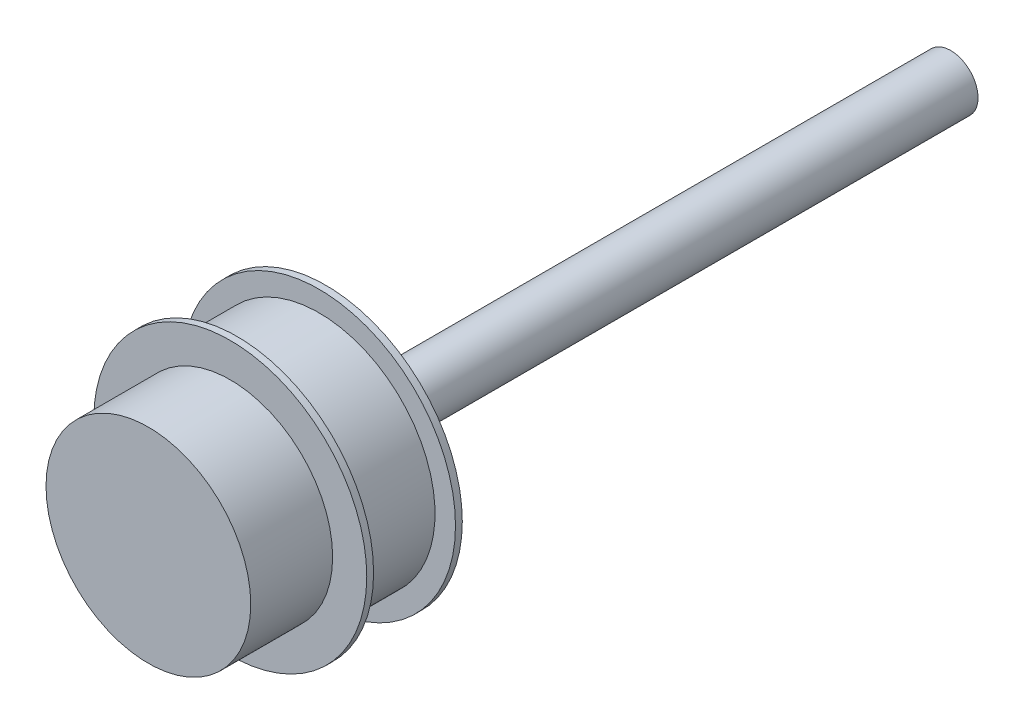
ISO-10303-21;
HEADER;
FILE_DESCRIPTION(('STEP AP214'),'2;1');
FILE_NAME('part.step','',(''),(''),'','','');
FILE_SCHEMA(('AUTOMOTIVE_DESIGN { 1 0 10303 214 1 1 1 1 }'));
ENDSEC;
DATA;
#1=APPLICATION_CONTEXT('core data for automotive mechanical design processes');
#2=APPLICATION_PROTOCOL_DEFINITION('international standard','automotive_design',2000,#1);
#3=PRODUCT_CONTEXT('',#1,'mechanical');
#4=PRODUCT('Part','Part','',(#3));
#5=PRODUCT_RELATED_PRODUCT_CATEGORY('part','',(#4));
#6=PRODUCT_DEFINITION_FORMATION('','',#4);
#7=PRODUCT_DEFINITION_CONTEXT('part definition',#1,'design');
#8=PRODUCT_DEFINITION('design','',#6,#7);
#9=PRODUCT_DEFINITION_SHAPE('','',#8);
#10=(LENGTH_UNIT() NAMED_UNIT(*) SI_UNIT(.MILLI.,.METRE.));
#11=(NAMED_UNIT(*) PLANE_ANGLE_UNIT() SI_UNIT($,.RADIAN.));
#12=(NAMED_UNIT(*) SI_UNIT($,.STERADIAN.) SOLID_ANGLE_UNIT());
#13=UNCERTAINTY_MEASURE_WITH_UNIT(LENGTH_MEASURE(1.E-05),#10,'distance_accuracy_value','');
#14=(GEOMETRIC_REPRESENTATION_CONTEXT(3) GLOBAL_UNCERTAINTY_ASSIGNED_CONTEXT((#13)) GLOBAL_UNIT_ASSIGNED_CONTEXT((#10,
#11,#12)) REPRESENTATION_CONTEXT('',''));
#15=CARTESIAN_POINT('',(0.,0.,0.));
#16=DIRECTION('',(0.,0.,1.));
#17=DIRECTION('',(1.,0.,0.));
#18=AXIS2_PLACEMENT_3D('',#15,#16,#17);
#19=CARTESIAN_POINT('',(0.,0.,104.56));
#20=DIRECTION('',(0.,0.,-1.));
#21=DIRECTION('',(-1.,0.,0.));
#22=AXIS2_PLACEMENT_3D('',#19,#20,#21);
#23=CYLINDRICAL_SURFACE('',#22,17.);
#24=CARTESIAN_POINT('',(0.,0.,104.56));
#25=DIRECTION('',(0.,0.,-1.));
#26=DIRECTION('',(-1.,0.,0.));
#27=AXIS2_PLACEMENT_3D('',#24,#25,#26);
#28=CIRCLE('',#27,17.);
#29=CARTESIAN_POINT('',(-17.,0.,104.56));
#30=VERTEX_POINT('',#29);
#31=EDGE_CURVE('E118',#30,#30,#28,.T.);
#32=CARTESIAN_POINT('',(0.,0.,92.56));
#33=DIRECTION('',(0.,0.,-1.));
#34=DIRECTION('',(-1.,0.,0.));
#35=AXIS2_PLACEMENT_3D('',#32,#33,#34);
#36=CIRCLE('',#35,17.);
#37=CARTESIAN_POINT('',(-17.,0.,92.56));
#38=VERTEX_POINT('',#37);
#39=EDGE_CURVE('E41',#38,#38,#36,.F.);
#40=CARTESIAN_POINT('',(-17.,0.,104.56));
#41=CARTESIAN_POINT('',(-17.,0.,104.435));
#42=CARTESIAN_POINT('',(-17.,0.,104.31));
#43=CARTESIAN_POINT('',(-17.,0.,104.06));
#44=CARTESIAN_POINT('',(-17.,0.,103.935));
#45=CARTESIAN_POINT('',(-17.,0.,103.685));
#46=CARTESIAN_POINT('',(-17.,0.,103.56));
#47=CARTESIAN_POINT('',(-17.,0.,103.31));
#48=CARTESIAN_POINT('',(-17.,0.,103.185));
#49=CARTESIAN_POINT('',(-17.,0.,102.935));
#50=CARTESIAN_POINT('',(-17.,0.,102.81));
#51=CARTESIAN_POINT('',(-17.,0.,102.56));
#52=CARTESIAN_POINT('',(-17.,0.,102.435));
#53=CARTESIAN_POINT('',(-17.,0.,102.185));
#54=CARTESIAN_POINT('',(-17.,0.,102.06));
#55=CARTESIAN_POINT('',(-17.,0.,101.81));
#56=CARTESIAN_POINT('',(-17.,0.,101.685));
#57=CARTESIAN_POINT('',(-17.,0.,101.435));
#58=CARTESIAN_POINT('',(-17.,0.,101.31));
#59=CARTESIAN_POINT('',(-17.,0.,101.06));
#60=CARTESIAN_POINT('',(-17.,0.,100.935));
#61=CARTESIAN_POINT('',(-17.,0.,100.685));
#62=CARTESIAN_POINT('',(-17.,0.,100.56));
#63=CARTESIAN_POINT('',(-17.,0.,100.31));
#64=CARTESIAN_POINT('',(-17.,0.,100.185));
#65=CARTESIAN_POINT('',(-17.,0.,99.935));
#66=CARTESIAN_POINT('',(-17.,0.,99.81));
#67=CARTESIAN_POINT('',(-17.,0.,99.56));
#68=CARTESIAN_POINT('',(-17.,0.,99.435));
#69=CARTESIAN_POINT('',(-17.,0.,99.185));
#70=CARTESIAN_POINT('',(-17.,0.,99.06));
#71=CARTESIAN_POINT('',(-17.,0.,98.81));
#72=CARTESIAN_POINT('',(-17.,0.,98.685));
#73=CARTESIAN_POINT('',(-17.,0.,98.435));
#74=CARTESIAN_POINT('',(-17.,0.,98.31));
#75=CARTESIAN_POINT('',(-17.,0.,98.06));
#76=CARTESIAN_POINT('',(-17.,0.,97.935));
#77=CARTESIAN_POINT('',(-17.,0.,97.685));
#78=CARTESIAN_POINT('',(-17.,0.,97.56));
#79=CARTESIAN_POINT('',(-17.,0.,97.31));
#80=CARTESIAN_POINT('',(-17.,0.,97.185));
#81=CARTESIAN_POINT('',(-17.,0.,96.935));
#82=CARTESIAN_POINT('',(-17.,0.,96.81));
#83=CARTESIAN_POINT('',(-17.,0.,96.56));
#84=CARTESIAN_POINT('',(-17.,0.,96.435));
#85=CARTESIAN_POINT('',(-17.,0.,96.185));
#86=CARTESIAN_POINT('',(-17.,0.,96.06));
#87=CARTESIAN_POINT('',(-17.,0.,95.81));
#88=CARTESIAN_POINT('',(-17.,0.,95.685));
#89=CARTESIAN_POINT('',(-17.,0.,95.435));
#90=CARTESIAN_POINT('',(-17.,0.,95.31));
#91=CARTESIAN_POINT('',(-17.,0.,95.06));
#92=CARTESIAN_POINT('',(-17.,0.,94.935));
#93=CARTESIAN_POINT('',(-17.,0.,94.685));
#94=CARTESIAN_POINT('',(-17.,0.,94.56));
#95=CARTESIAN_POINT('',(-17.,0.,94.31));
#96=CARTESIAN_POINT('',(-17.,0.,94.185));
#97=CARTESIAN_POINT('',(-17.,0.,93.935));
#98=CARTESIAN_POINT('',(-17.,0.,93.81));
#99=CARTESIAN_POINT('',(-17.,0.,93.56));
#100=CARTESIAN_POINT('',(-17.,0.,93.435));
#101=CARTESIAN_POINT('',(-17.,0.,93.185));
#102=CARTESIAN_POINT('',(-17.,0.,93.06));
#103=CARTESIAN_POINT('',(-17.,0.,92.81));
#104=CARTESIAN_POINT('',(-17.,0.,92.685));
#105=CARTESIAN_POINT('',(-17.,0.,92.56));
#106=B_SPLINE_CURVE_WITH_KNOTS('',3,(#40,#41,#42,#43,#44,#45,#46,#47,#48,#49,#50,#51,#52,#53,
#54,#55,#56,#57,#58,#59,#60,#61,#62,#63,#64,#65,#66,#67,#68,#69,#70,#71,#72,#73,#74,#75,#76,#77,
#78,#79,#80,#81,#82,#83,#84,#85,#86,#87,#88,#89,#90,#91,#92,#93,#94,#95,#96,#97,#98,#99,#100,
#101,#102,#103,#104,#105),.UNSPECIFIED.,.F.,.F.,(4,2,2,2,2,2,2,2,2,2,2,2,2,2,2,2,2,2,2,2,2,2,2,
2,2,2,2,2,2,2,2,2,4),(0.,0.374999999999986,0.749999999999987,1.12499999999999,1.49999999999999,
1.87499999999999,2.24999999999999,2.62499999999999,2.99999999999999,3.37499999999999,
3.74999999999999,4.12499999999999,4.49999999999999,4.87499999999999,5.24999999999999,
5.62499999999999,5.99999999999999,6.37499999999999,6.74999999999999,7.12499999999999,
7.49999999999999,7.87499999999999,8.24999999999999,8.62499999999999,8.99999999999999,
9.37499999999999,9.74999999999999,10.125,10.5,10.875,11.25,11.625,12.),.UNSPECIFIED.);
#107=EDGE_CURVE('BSEAM37',#30,#38,#106,.T.);
#108=ORIENTED_EDGE('',*,*,#31,.T.);
#109=ORIENTED_EDGE('',*,*,#39,.T.);
#110=ORIENTED_EDGE('',*,*,#107,.T.);
#111=ORIENTED_EDGE('',*,*,#107,.F.);
#112=EDGE_LOOP('',(#108,#110,#109,#111));
#113=FACE_BOUND('',#112,.T.);
#114=ADVANCED_FACE('F37',(#113),#23,.T.);
#115=CARTESIAN_POINT('',(0.,0.,105.56));
#116=DIRECTION('',(0.,0.,-1.));
#117=DIRECTION('',(-1.,0.,0.));
#118=AXIS2_PLACEMENT_3D('',#115,#116,#117);
#119=CYLINDRICAL_SURFACE('',#118,20.);
#120=CARTESIAN_POINT('',(0.,0.,105.56));
#121=DIRECTION('',(0.,0.,1.));
#122=DIRECTION('',(1.,0.,0.));
#123=AXIS2_PLACEMENT_3D('',#120,#121,#122);
#124=CIRCLE('',#123,20.);
#125=CARTESIAN_POINT('',(20.,0.,105.56));
#126=VERTEX_POINT('',#125);
#127=EDGE_CURVE('E56',#126,#126,#124,.T.);
#128=ORIENTED_EDGE('',*,*,#127,.F.);
#129=EDGE_LOOP('',(#128));
#130=FACE_BOUND('',#129,.T.);
#131=CARTESIAN_POINT('',(0.,0.,104.56));
#132=DIRECTION('',(0.,0.,-1.));
#133=DIRECTION('',(-1.,0.,0.));
#134=AXIS2_PLACEMENT_3D('',#131,#132,#133);
#135=CIRCLE('',#134,20.);
#136=CARTESIAN_POINT('',(-20.,0.,104.56));
#137=VERTEX_POINT('',#136);
#138=EDGE_CURVE('E119',#137,#137,#135,.T.);
#139=ORIENTED_EDGE('',*,*,#138,.F.);
#140=EDGE_LOOP('',(#139));
#141=FACE_BOUND('',#140,.T.);
#142=ADVANCED_FACE('F76',(#130,#141),#119,.T.);
#143=CARTESIAN_POINT('',(0.,0.,105.56));
#144=DIRECTION('',(0.,0.,1.));
#145=DIRECTION('',(1.,0.,0.));
#146=AXIS2_PLACEMENT_3D('',#143,#144,#145);
#147=PLANE('',#146);
#148=CARTESIAN_POINT('',(0.,0.,105.56));
#149=DIRECTION('',(0.,0.,1.));
#150=DIRECTION('',(1.,0.,0.));
#151=AXIS2_PLACEMENT_3D('',#148,#149,#150);
#152=CIRCLE('',#151,15.);
#153=CARTESIAN_POINT('',(15.,0.,105.56));
#154=VERTEX_POINT('',#153);
#155=EDGE_CURVE('E10',#154,#154,#152,.T.);
#156=ORIENTED_EDGE('',*,*,#155,.F.);
#157=EDGE_LOOP('',(#156));
#158=FACE_BOUND('',#157,.T.);
#159=ORIENTED_EDGE('',*,*,#127,.T.);
#160=EDGE_LOOP('',(#159));
#161=FACE_BOUND('',#160,.T.);
#162=ADVANCED_FACE('F82',(#158,#161),#147,.T.);
#163=CARTESIAN_POINT('',(0.,0.,117.56));
#164=DIRECTION('',(0.,0.,-1.));
#165=DIRECTION('',(-1.,0.,0.));
#166=AXIS2_PLACEMENT_3D('',#163,#164,#165);
#167=CYLINDRICAL_SURFACE('',#166,15.);
#168=CARTESIAN_POINT('',(0.,0.,117.56));
#169=DIRECTION('',(0.,0.,1.));
#170=DIRECTION('',(1.,0.,0.));
#171=AXIS2_PLACEMENT_3D('',#168,#169,#170);
#172=CIRCLE('',#171,15.);
#173=CARTESIAN_POINT('',(15.,0.,117.56));
#174=VERTEX_POINT('',#173);
#175=EDGE_CURVE('E54',#174,#174,#172,.T.);
#176=ORIENTED_EDGE('',*,*,#175,.F.);
#177=EDGE_LOOP('',(#176));
#178=FACE_BOUND('',#177,.T.);
#179=ORIENTED_EDGE('',*,*,#155,.T.);
#180=EDGE_LOOP('',(#179));
#181=FACE_BOUND('',#180,.T.);
#182=ADVANCED_FACE('F95',(#178,#181),#167,.T.);
#183=CARTESIAN_POINT('',(0.,0.,117.56));
#184=DIRECTION('',(0.,0.,1.));
#185=DIRECTION('',(1.,0.,0.));
#186=AXIS2_PLACEMENT_3D('',#183,#184,#185);
#187=PLANE('',#186);
#188=ORIENTED_EDGE('',*,*,#175,.T.);
#189=EDGE_LOOP('',(#188));
#190=FACE_BOUND('',#189,.T.);
#191=ADVANCED_FACE('F91',(#190),#187,.T.);
#192=CARTESIAN_POINT('',(0.,0.,104.56));
#193=DIRECTION('',(0.,0.,-1.));
#194=DIRECTION('',(-1.,0.,0.));
#195=AXIS2_PLACEMENT_3D('',#192,#193,#194);
#196=PLANE('',#195);
#197=ORIENTED_EDGE('',*,*,#31,.F.);
#198=EDGE_LOOP('',(#197));
#199=FACE_BOUND('',#198,.T.);
#200=ORIENTED_EDGE('',*,*,#138,.T.);
#201=EDGE_LOOP('',(#200));
#202=FACE_BOUND('',#201,.T.);
#203=ADVANCED_FACE('F88',(#199,#202),#196,.T.);
#204=CARTESIAN_POINT('',(0.,0.,92.56));
#205=DIRECTION('',(0.,0.,-1.));
#206=DIRECTION('',(-1.,0.,0.));
#207=AXIS2_PLACEMENT_3D('',#204,#205,#206);
#208=CYLINDRICAL_SURFACE('',#207,20.);
#209=CARTESIAN_POINT('',(0.,0.,92.56));
#210=DIRECTION('',(0.,0.,-1.));
#211=DIRECTION('',(-1.,0.,0.));
#212=AXIS2_PLACEMENT_3D('',#209,#210,#211);
#213=CIRCLE('',#212,20.);
#214=CARTESIAN_POINT('',(-20.,0.,92.56));
#215=VERTEX_POINT('',#214);
#216=EDGE_CURVE('E113',#215,#215,#213,.T.);
#217=ORIENTED_EDGE('',*,*,#216,.T.);
#218=EDGE_LOOP('',(#217));
#219=FACE_BOUND('',#218,.T.);
#220=CARTESIAN_POINT('',(0.,0.,91.56));
#221=DIRECTION('',(0.,0.,-1.));
#222=DIRECTION('',(-1.,0.,0.));
#223=AXIS2_PLACEMENT_3D('',#220,#221,#222);
#224=CIRCLE('',#223,20.);
#225=CARTESIAN_POINT('',(-20.,0.,91.56));
#226=VERTEX_POINT('',#225);
#227=EDGE_CURVE('E111',#226,#226,#224,.T.);
#228=ORIENTED_EDGE('',*,*,#227,.F.);
#229=EDGE_LOOP('',(#228));
#230=FACE_BOUND('',#229,.T.);
#231=ADVANCED_FACE('F71',(#219,#230),#208,.T.);
#232=CARTESIAN_POINT('',(0.,0.,92.56));
#233=DIRECTION('',(0.,0.,-1.));
#234=DIRECTION('',(-1.,0.,0.));
#235=AXIS2_PLACEMENT_3D('',#232,#233,#234);
#236=PLANE('',#235);
#237=ORIENTED_EDGE('',*,*,#39,.F.);
#238=EDGE_LOOP('',(#237));
#239=FACE_BOUND('',#238,.T.);
#240=ORIENTED_EDGE('',*,*,#216,.F.);
#241=EDGE_LOOP('',(#240));
#242=FACE_BOUND('',#241,.T.);
#243=ADVANCED_FACE('F64',(#239,#242),#236,.F.);
#244=CARTESIAN_POINT('',(0.,0.,0.));
#245=DIRECTION('',(0.,0.,1.));
#246=DIRECTION('',(1.,0.,0.));
#247=AXIS2_PLACEMENT_3D('',#244,#245,#246);
#248=PLANE('',#247);
#249=CARTESIAN_POINT('',(0.,0.,0.));
#250=DIRECTION('',(0.,0.,1.));
#251=DIRECTION('',(1.,0.,0.));
#252=AXIS2_PLACEMENT_3D('',#249,#250,#251);
#253=CIRCLE('',#252,4.);
#254=CARTESIAN_POINT('',(4.,0.,0.));
#255=VERTEX_POINT('',#254);
#256=EDGE_CURVE('E50',#255,#255,#253,.T.);
#257=ORIENTED_EDGE('',*,*,#256,.F.);
#258=EDGE_LOOP('',(#257));
#259=FACE_BOUND('',#258,.T.);
#260=ADVANCED_FACE('F62',(#259),#248,.F.);
#261=CARTESIAN_POINT('',(0.,0.,91.56));
#262=DIRECTION('',(0.,0.,-1.));
#263=DIRECTION('',(-1.,0.,0.));
#264=AXIS2_PLACEMENT_3D('',#261,#262,#263);
#265=CYLINDRICAL_SURFACE('',#264,4.);
#266=CARTESIAN_POINT('',(0.,0.,91.56));
#267=DIRECTION('',(0.,0.,1.));
#268=DIRECTION('',(1.,0.,0.));
#269=AXIS2_PLACEMENT_3D('',#266,#267,#268);
#270=CIRCLE('',#269,4.);
#271=CARTESIAN_POINT('',(4.,0.,91.56));
#272=VERTEX_POINT('',#271);
#273=EDGE_CURVE('E45',#272,#272,#270,.T.);
#274=ORIENTED_EDGE('',*,*,#273,.F.);
#275=EDGE_LOOP('',(#274));
#276=FACE_BOUND('',#275,.T.);
#277=ORIENTED_EDGE('',*,*,#256,.T.);
#278=EDGE_LOOP('',(#277));
#279=FACE_BOUND('',#278,.T.);
#280=ADVANCED_FACE('F39',(#276,#279),#265,.T.);
#281=CARTESIAN_POINT('',(0.,0.,91.56));
#282=DIRECTION('',(0.,0.,1.));
#283=DIRECTION('',(1.,0.,0.));
#284=AXIS2_PLACEMENT_3D('',#281,#282,#283);
#285=PLANE('',#284);
#286=ORIENTED_EDGE('',*,*,#273,.T.);
#287=EDGE_LOOP('',(#286));
#288=FACE_BOUND('',#287,.T.);
#289=ORIENTED_EDGE('',*,*,#227,.T.);
#290=EDGE_LOOP('',(#289));
#291=FACE_BOUND('',#290,.T.);
#292=ADVANCED_FACE('F69',(#288,#291),#285,.F.);
#293=CLOSED_SHELL('',(#114,#142,#162,#182,#191,#203,#231,#243,#260,#280,#292));
#294=MANIFOLD_SOLID_BREP('B2',#293);
#295=ADVANCED_BREP_SHAPE_REPRESENTATION('',(#18,#294),#14);
#296=SHAPE_DEFINITION_REPRESENTATION(#9,#295);
ENDSEC;
END-ISO-10303-21;
